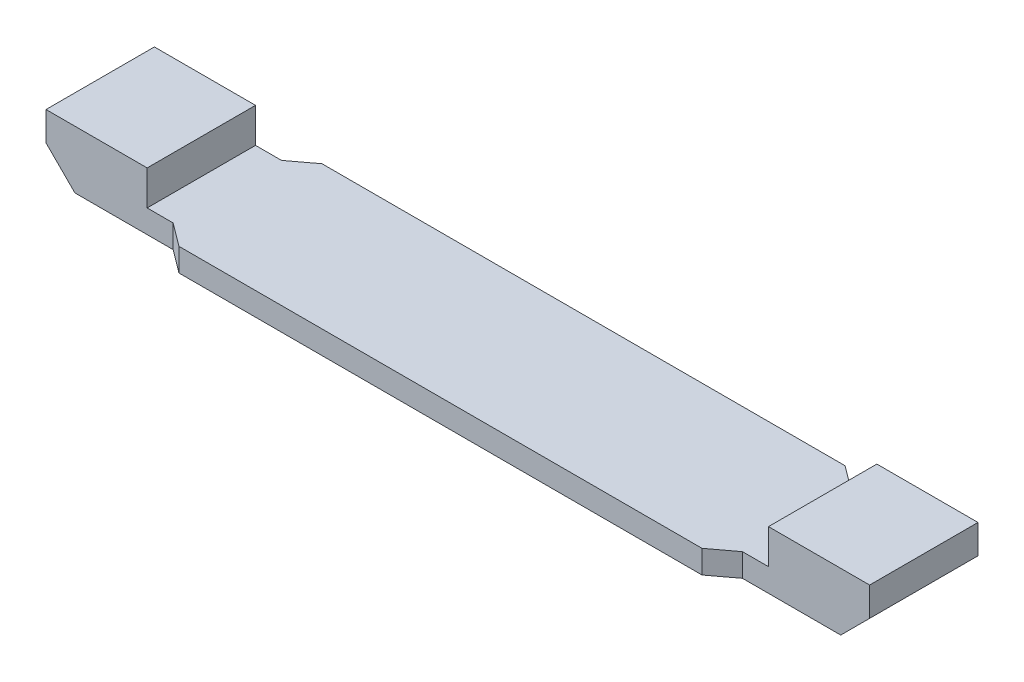
ISO-10303-21;
HEADER;
FILE_DESCRIPTION(('STEP AP214'),'2;1');
FILE_NAME('part.step','',(''),(''),'','','');
FILE_SCHEMA(('AUTOMOTIVE_DESIGN { 1 0 10303 214 1 1 1 1 }'));
ENDSEC;
DATA;
#1=APPLICATION_CONTEXT('core data for automotive mechanical design processes');
#2=APPLICATION_PROTOCOL_DEFINITION('international standard','automotive_design',2000,#1);
#3=PRODUCT_CONTEXT('',#1,'mechanical');
#4=PRODUCT('Part','Part','',(#3));
#5=PRODUCT_RELATED_PRODUCT_CATEGORY('part','',(#4));
#6=PRODUCT_DEFINITION_FORMATION('','',#4);
#7=PRODUCT_DEFINITION_CONTEXT('part definition',#1,'design');
#8=PRODUCT_DEFINITION('design','',#6,#7);
#9=PRODUCT_DEFINITION_SHAPE('','',#8);
#10=(LENGTH_UNIT() NAMED_UNIT(*) SI_UNIT(.MILLI.,.METRE.));
#11=(NAMED_UNIT(*) PLANE_ANGLE_UNIT() SI_UNIT($,.RADIAN.));
#12=(NAMED_UNIT(*) SI_UNIT($,.STERADIAN.) SOLID_ANGLE_UNIT());
#13=UNCERTAINTY_MEASURE_WITH_UNIT(LENGTH_MEASURE(1.E-05),#10,'distance_accuracy_value','');
#14=(GEOMETRIC_REPRESENTATION_CONTEXT(3) GLOBAL_UNCERTAINTY_ASSIGNED_CONTEXT((#13)) GLOBAL_UNIT_ASSIGNED_CONTEXT((#10,
#11,#12)) REPRESENTATION_CONTEXT('',''));
#15=CARTESIAN_POINT('',(0.,0.,0.));
#16=DIRECTION('',(0.,0.,1.));
#17=DIRECTION('',(1.,0.,0.));
#18=AXIS2_PLACEMENT_3D('',#15,#16,#17);
#19=CARTESIAN_POINT('',(0.,8.,0.));
#20=DIRECTION('',(0.,-1.,0.));
#21=DIRECTION('',(0.,0.,-1.));
#22=AXIS2_PLACEMENT_3D('',#19,#20,#21);
#23=PLANE('',#22);
#24=DIRECTION('',(0.8,0.,-0.6));
#25=VECTOR('',#24,1.);
#26=CARTESIAN_POINT('',(78.5999999999999,8.,104.8));
#27=LINE('',#26,#25);
#28=CARTESIAN_POINT('',(233.,8.,-11.));
#29=VERTEX_POINT('',#28);
#30=CARTESIAN_POINT('',(241.,8.,-17.));
#31=VERTEX_POINT('',#30);
#32=EDGE_CURVE('E199',#29,#31,#27,.T.);
#33=ORIENTED_EDGE('',*,*,#32,.T.);
#34=DIRECTION('',(1.,0.,0.));
#35=VECTOR('',#34,1.);
#36=CARTESIAN_POINT('',(0.,8.,-17.));
#37=LINE('',#36,#35);
#38=CARTESIAN_POINT('',(250.,8.,-17.));
#39=VERTEX_POINT('',#38);
#40=EDGE_CURVE('E322',#31,#39,#37,.T.);
#41=ORIENTED_EDGE('',*,*,#40,.T.);
#42=DIRECTION('',(0.,0.,1.));
#43=VECTOR('',#42,1.);
#44=CARTESIAN_POINT('',(250.,8.,-71.5));
#45=LINE('',#44,#43);
#46=CARTESIAN_POINT('',(250.,8.,-54.5));
#47=VERTEX_POINT('',#46);
#48=EDGE_CURVE('E196',#47,#39,#45,.T.);
#49=ORIENTED_EDGE('',*,*,#48,.F.);
#50=DIRECTION('',(-1.,0.,0.));
#51=VECTOR('',#50,1.);
#52=CARTESIAN_POINT('',(0.,8.,-54.5));
#53=LINE('',#52,#51);
#54=CARTESIAN_POINT('',(241.,8.,-54.5));
#55=VERTEX_POINT('',#54);
#56=EDGE_CURVE('E316',#47,#55,#53,.T.);
#57=ORIENTED_EDGE('',*,*,#56,.T.);
#58=DIRECTION('',(-0.800000000000001,0.,-0.599999999999999));
#59=VECTOR('',#58,1.);
#60=CARTESIAN_POINT('',(112.92,8.,-150.56));
#61=LINE('',#60,#59);
#62=CARTESIAN_POINT('',(233.,8.,-60.5));
#63=VERTEX_POINT('',#62);
#64=EDGE_CURVE('E325',#55,#63,#61,.T.);
#65=ORIENTED_EDGE('',*,*,#64,.T.);
#66=DIRECTION('',(-1.,0.,0.));
#67=VECTOR('',#66,1.);
#68=CARTESIAN_POINT('',(0.,8.,-60.5));
#69=LINE('',#68,#67);
#70=CARTESIAN_POINT('',(52.,8.,-60.5));
#71=VERTEX_POINT('',#70);
#72=EDGE_CURVE('E328',#63,#71,#69,.T.);
#73=ORIENTED_EDGE('',*,*,#72,.T.);
#74=DIRECTION('',(-0.8,0.,0.6));
#75=VECTOR('',#74,1.);
#76=CARTESIAN_POINT('',(-10.32,8.,-13.76));
#77=LINE('',#76,#75);
#78=CARTESIAN_POINT('',(44.,8.,-54.5));
#79=VERTEX_POINT('',#78);
#80=EDGE_CURVE('E331',#71,#79,#77,.T.);
#81=ORIENTED_EDGE('',*,*,#80,.T.);
#82=DIRECTION('',(-1.,0.,0.));
#83=VECTOR('',#82,1.);
#84=CARTESIAN_POINT('',(0.,8.,-54.5));
#85=LINE('',#84,#83);
#86=CARTESIAN_POINT('',(35.,8.,-54.5));
#87=VERTEX_POINT('',#86);
#88=EDGE_CURVE('E306',#79,#87,#85,.T.);
#89=ORIENTED_EDGE('',*,*,#88,.T.);
#90=DIRECTION('',(0.,0.,-1.));
#91=VECTOR('',#90,1.);
#92=CARTESIAN_POINT('',(35.,8.,-71.5));
#93=LINE('',#92,#91);
#94=CARTESIAN_POINT('',(35.,8.,-17.));
#95=VERTEX_POINT('',#94);
#96=EDGE_CURVE('E192',#95,#87,#93,.T.);
#97=ORIENTED_EDGE('',*,*,#96,.F.);
#98=DIRECTION('',(1.,0.,0.));
#99=VECTOR('',#98,1.);
#100=CARTESIAN_POINT('',(0.,8.,-17.));
#101=LINE('',#100,#99);
#102=CARTESIAN_POINT('',(44.,8.,-17.));
#103=VERTEX_POINT('',#102);
#104=EDGE_CURVE('E310',#95,#103,#101,.T.);
#105=ORIENTED_EDGE('',*,*,#104,.T.);
#106=DIRECTION('',(0.8,0.,0.6));
#107=VECTOR('',#106,1.);
#108=CARTESIAN_POINT('',(24.,8.,-32.));
#109=LINE('',#108,#107);
#110=CARTESIAN_POINT('',(52.,8.,-11.));
#111=VERTEX_POINT('',#110);
#112=EDGE_CURVE('E334',#103,#111,#109,.T.);
#113=ORIENTED_EDGE('',*,*,#112,.T.);
#114=DIRECTION('',(1.,0.,0.));
#115=VECTOR('',#114,1.);
#116=CARTESIAN_POINT('',(0.,8.,-11.));
#117=LINE('',#116,#115);
#118=EDGE_CURVE('E336',#111,#29,#117,.T.);
#119=ORIENTED_EDGE('',*,*,#118,.T.);
#120=EDGE_LOOP('',(#33,#41,#49,#57,#65,#73,#81,#89,#97,#105,#113,#119));
#121=FACE_BOUND('',#120,.T.);
#122=ADVANCED_FACE('F43',(#121),#23,.F.);
#123=CARTESIAN_POINT('',(0.,8.,0.));
#124=DIRECTION('',(1.,0.,0.));
#125=DIRECTION('',(0.,0.,-1.));
#126=AXIS2_PLACEMENT_3D('',#123,#124,#125);
#127=PLANE('',#126);
#128=DIRECTION('',(0.,-1.,0.));
#129=VECTOR('',#128,1.);
#130=CARTESIAN_POINT('',(0.,20.,-54.5));
#131=LINE('',#130,#129);
#132=CARTESIAN_POINT('',(0.,20.,-54.5));
#133=VERTEX_POINT('',#132);
#134=CARTESIAN_POINT('',(0.,10.,-54.5));
#135=VERTEX_POINT('',#134);
#136=EDGE_CURVE('E303',#133,#135,#131,.T.);
#137=ORIENTED_EDGE('',*,*,#136,.T.);
#138=DIRECTION('',(0.,0.,1.));
#139=VECTOR('',#138,1.);
#140=CARTESIAN_POINT('',(0.,10.,-17.));
#141=LINE('',#140,#139);
#142=CARTESIAN_POINT('',(0.,10.,-17.));
#143=VERTEX_POINT('',#142);
#144=EDGE_CURVE('E185',#135,#143,#141,.T.);
#145=ORIENTED_EDGE('',*,*,#144,.T.);
#146=DIRECTION('',(0.,-1.,0.));
#147=VECTOR('',#146,1.);
#148=CARTESIAN_POINT('',(0.,20.,-17.));
#149=LINE('',#148,#147);
#150=CARTESIAN_POINT('',(0.,20.,-17.));
#151=VERTEX_POINT('',#150);
#152=EDGE_CURVE('E171',#151,#143,#149,.T.);
#153=ORIENTED_EDGE('',*,*,#152,.F.);
#154=DIRECTION('',(0.,0.,1.));
#155=VECTOR('',#154,1.);
#156=CARTESIAN_POINT('',(0.,20.,-71.5));
#157=LINE('',#156,#155);
#158=EDGE_CURVE('E184',#133,#151,#157,.T.);
#159=ORIENTED_EDGE('',*,*,#158,.F.);
#160=EDGE_LOOP('',(#137,#145,#153,#159));
#161=FACE_BOUND('',#160,.T.);
#162=ADVANCED_FACE('F183',(#161),#127,.F.);
#163=CARTESIAN_POINT('',(285.,8.,0.));
#164=DIRECTION('',(-1.,0.,0.));
#165=DIRECTION('',(0.,0.,1.));
#166=AXIS2_PLACEMENT_3D('',#163,#164,#165);
#167=PLANE('',#166);
#168=DIRECTION('',(0.,-1.,0.));
#169=VECTOR('',#168,1.);
#170=CARTESIAN_POINT('',(285.,20.,-17.));
#171=LINE('',#170,#169);
#172=CARTESIAN_POINT('',(285.,20.,-17.));
#173=VERTEX_POINT('',#172);
#174=CARTESIAN_POINT('',(285.,10.,-17.));
#175=VERTEX_POINT('',#174);
#176=EDGE_CURVE('E270',#173,#175,#171,.T.);
#177=ORIENTED_EDGE('',*,*,#176,.T.);
#178=DIRECTION('',(0.,0.,-1.));
#179=VECTOR('',#178,1.);
#180=CARTESIAN_POINT('',(285.,10.,-54.5));
#181=LINE('',#180,#179);
#182=CARTESIAN_POINT('',(285.,10.,-54.5));
#183=VERTEX_POINT('',#182);
#184=EDGE_CURVE('E211',#175,#183,#181,.T.);
#185=ORIENTED_EDGE('',*,*,#184,.T.);
#186=DIRECTION('',(0.,-1.,0.));
#187=VECTOR('',#186,1.);
#188=CARTESIAN_POINT('',(285.,20.,-54.5));
#189=LINE('',#188,#187);
#190=CARTESIAN_POINT('',(285.,20.,-54.5));
#191=VERTEX_POINT('',#190);
#192=EDGE_CURVE('E286',#191,#183,#189,.T.);
#193=ORIENTED_EDGE('',*,*,#192,.F.);
#194=DIRECTION('',(0.,0.,-1.));
#195=VECTOR('',#194,1.);
#196=CARTESIAN_POINT('',(285.,20.,-71.5));
#197=LINE('',#196,#195);
#198=EDGE_CURVE('E204',#173,#191,#197,.T.);
#199=ORIENTED_EDGE('',*,*,#198,.F.);
#200=EDGE_LOOP('',(#177,#185,#193,#199));
#201=FACE_BOUND('',#200,.T.);
#202=ADVANCED_FACE('F249',(#201),#167,.F.);
#203=CARTESIAN_POINT('',(0.,0.,0.));
#204=DIRECTION('',(0.,-1.,0.));
#205=DIRECTION('',(0.,0.,-1.));
#206=AXIS2_PLACEMENT_3D('',#203,#204,#205);
#207=PLANE('',#206);
#208=DIRECTION('',(-1.,0.,0.));
#209=VECTOR('',#208,1.);
#210=CARTESIAN_POINT('',(285.,0.,-54.5));
#211=LINE('',#210,#209);
#212=CARTESIAN_POINT('',(275.,0.,-54.5));
#213=VERTEX_POINT('',#212);
#214=CARTESIAN_POINT('',(241.,0.,-54.5));
#215=VERTEX_POINT('',#214);
#216=EDGE_CURVE('E284',#213,#215,#211,.T.);
#217=ORIENTED_EDGE('',*,*,#216,.F.);
#218=DIRECTION('',(0.,0.,1.));
#219=VECTOR('',#218,1.);
#220=CARTESIAN_POINT('',(275.,0.,-17.));
#221=LINE('',#220,#219);
#222=CARTESIAN_POINT('',(275.,0.,-17.));
#223=VERTEX_POINT('',#222);
#224=EDGE_CURVE('E218',#213,#223,#221,.T.);
#225=ORIENTED_EDGE('',*,*,#224,.T.);
#226=DIRECTION('',(1.,0.,0.));
#227=VECTOR('',#226,1.);
#228=CARTESIAN_POINT('',(285.,0.,-17.));
#229=LINE('',#228,#227);
#230=CARTESIAN_POINT('',(241.,0.,-17.));
#231=VERTEX_POINT('',#230);
#232=EDGE_CURVE('E179',#231,#223,#229,.T.);
#233=ORIENTED_EDGE('',*,*,#232,.F.);
#234=DIRECTION('',(0.8,0.,-0.6));
#235=VECTOR('',#234,1.);
#236=CARTESIAN_POINT('',(241.,0.,-17.));
#237=LINE('',#236,#235);
#238=CARTESIAN_POINT('',(233.,0.,-11.));
#239=VERTEX_POINT('',#238);
#240=EDGE_CURVE('E387',#239,#231,#237,.T.);
#241=ORIENTED_EDGE('',*,*,#240,.F.);
#242=DIRECTION('',(1.,0.,0.));
#243=VECTOR('',#242,1.);
#244=CARTESIAN_POINT('',(52.,0.,-11.));
#245=LINE('',#244,#243);
#246=CARTESIAN_POINT('',(52.,0.,-11.));
#247=VERTEX_POINT('',#246);
#248=EDGE_CURVE('E349',#247,#239,#245,.T.);
#249=ORIENTED_EDGE('',*,*,#248,.F.);
#250=DIRECTION('',(0.8,0.,0.6));
#251=VECTOR('',#250,1.);
#252=CARTESIAN_POINT('',(44.,0.,-17.));
#253=LINE('',#252,#251);
#254=CARTESIAN_POINT('',(44.,0.,-17.));
#255=VERTEX_POINT('',#254);
#256=EDGE_CURVE('E233',#255,#247,#253,.T.);
#257=ORIENTED_EDGE('',*,*,#256,.F.);
#258=DIRECTION('',(1.,0.,0.));
#259=VECTOR('',#258,1.);
#260=CARTESIAN_POINT('',(0.,0.,-17.));
#261=LINE('',#260,#259);
#262=CARTESIAN_POINT('',(10.0000000000001,0.,-17.));
#263=VERTEX_POINT('',#262);
#264=EDGE_CURVE('E224',#263,#255,#261,.T.);
#265=ORIENTED_EDGE('',*,*,#264,.F.);
#266=DIRECTION('',(0.,0.,-1.));
#267=VECTOR('',#266,1.);
#268=CARTESIAN_POINT('',(10.0000000000001,0.,-54.5));
#269=LINE('',#268,#267);
#270=CARTESIAN_POINT('',(10.0000000000001,0.,-54.5));
#271=VERTEX_POINT('',#270);
#272=EDGE_CURVE('E216',#263,#271,#269,.T.);
#273=ORIENTED_EDGE('',*,*,#272,.T.);
#274=DIRECTION('',(-1.,0.,0.));
#275=VECTOR('',#274,1.);
#276=CARTESIAN_POINT('',(0.,0.,-54.5));
#277=LINE('',#276,#275);
#278=CARTESIAN_POINT('',(44.,0.,-54.5));
#279=VERTEX_POINT('',#278);
#280=EDGE_CURVE('E234',#279,#271,#277,.T.);
#281=ORIENTED_EDGE('',*,*,#280,.F.);
#282=DIRECTION('',(-0.8,0.,0.6));
#283=VECTOR('',#282,1.);
#284=CARTESIAN_POINT('',(44.,0.,-54.5));
#285=LINE('',#284,#283);
#286=CARTESIAN_POINT('',(52.,0.,-60.5));
#287=VERTEX_POINT('',#286);
#288=EDGE_CURVE('E302',#287,#279,#285,.T.);
#289=ORIENTED_EDGE('',*,*,#288,.F.);
#290=DIRECTION('',(-1.,0.,0.));
#291=VECTOR('',#290,1.);
#292=CARTESIAN_POINT('',(52.,0.,-60.5));
#293=LINE('',#292,#291);
#294=CARTESIAN_POINT('',(233.,0.,-60.5));
#295=VERTEX_POINT('',#294);
#296=EDGE_CURVE('E295',#295,#287,#293,.T.);
#297=ORIENTED_EDGE('',*,*,#296,.F.);
#298=DIRECTION('',(-0.800000000000001,0.,-0.599999999999999));
#299=VECTOR('',#298,1.);
#300=CARTESIAN_POINT('',(241.,0.,-54.5));
#301=LINE('',#300,#299);
#302=EDGE_CURVE('E292',#215,#295,#301,.T.);
#303=ORIENTED_EDGE('',*,*,#302,.F.);
#304=EDGE_LOOP('',(#217,#225,#233,#241,#249,#257,#265,#273,#281,#289,#297,#303));
#305=FACE_BOUND('',#304,.T.);
#306=ADVANCED_FACE('F229',(#305),#207,.T.);
#307=CARTESIAN_POINT('',(250.,20.,-71.5));
#308=DIRECTION('',(1.,0.,0.));
#309=DIRECTION('',(0.,0.,-1.));
#310=AXIS2_PLACEMENT_3D('',#307,#308,#309);
#311=PLANE('',#310);
#312=ORIENTED_EDGE('',*,*,#48,.T.);
#313=DIRECTION('',(0.,1.,0.));
#314=VECTOR('',#313,1.);
#315=CARTESIAN_POINT('',(250.,20.,-17.));
#316=LINE('',#315,#314);
#317=CARTESIAN_POINT('',(250.,20.,-17.));
#318=VERTEX_POINT('',#317);
#319=EDGE_CURVE('E319',#39,#318,#316,.T.);
#320=ORIENTED_EDGE('',*,*,#319,.T.);
#321=DIRECTION('',(0.,0.,1.));
#322=VECTOR('',#321,1.);
#323=CARTESIAN_POINT('',(250.,20.,-71.5));
#324=LINE('',#323,#322);
#325=CARTESIAN_POINT('',(250.,20.,-54.5));
#326=VERTEX_POINT('',#325);
#327=EDGE_CURVE('E205',#326,#318,#324,.T.);
#328=ORIENTED_EDGE('',*,*,#327,.F.);
#329=DIRECTION('',(0.,-1.,0.));
#330=VECTOR('',#329,1.);
#331=CARTESIAN_POINT('',(250.,20.,-54.5));
#332=LINE('',#331,#330);
#333=EDGE_CURVE('E313',#326,#47,#332,.T.);
#334=ORIENTED_EDGE('',*,*,#333,.T.);
#335=EDGE_LOOP('',(#312,#320,#328,#334));
#336=FACE_BOUND('',#335,.T.);
#337=ADVANCED_FACE('F258',(#336),#311,.F.);
#338=CARTESIAN_POINT('',(0.,20.,0.));
#339=DIRECTION('',(0.,-1.,0.));
#340=DIRECTION('',(0.,0.,-1.));
#341=AXIS2_PLACEMENT_3D('',#338,#339,#340);
#342=PLANE('',#341);
#343=ORIENTED_EDGE('',*,*,#327,.T.);
#344=DIRECTION('',(1.,0.,0.));
#345=VECTOR('',#344,1.);
#346=CARTESIAN_POINT('',(285.,20.,-17.));
#347=LINE('',#346,#345);
#348=EDGE_CURVE('E178',#318,#173,#347,.T.);
#349=ORIENTED_EDGE('',*,*,#348,.T.);
#350=ORIENTED_EDGE('',*,*,#198,.T.);
#351=DIRECTION('',(-1.,0.,0.));
#352=VECTOR('',#351,1.);
#353=CARTESIAN_POINT('',(285.,20.,-54.5));
#354=LINE('',#353,#352);
#355=EDGE_CURVE('E299',#191,#326,#354,.T.);
#356=ORIENTED_EDGE('',*,*,#355,.T.);
#357=EDGE_LOOP('',(#343,#349,#350,#356));
#358=FACE_BOUND('',#357,.T.);
#359=ADVANCED_FACE('F254',(#358),#342,.F.);
#360=CARTESIAN_POINT('',(35.,20.,-71.5));
#361=DIRECTION('',(-1.,0.,0.));
#362=DIRECTION('',(0.,0.,1.));
#363=AXIS2_PLACEMENT_3D('',#360,#361,#362);
#364=PLANE('',#363);
#365=DIRECTION('',(0.,0.,-1.));
#366=VECTOR('',#365,1.);
#367=CARTESIAN_POINT('',(35.,20.,-71.5));
#368=LINE('',#367,#366);
#369=CARTESIAN_POINT('',(35.,20.,-17.));
#370=VERTEX_POINT('',#369);
#371=CARTESIAN_POINT('',(35.,20.,-54.5));
#372=VERTEX_POINT('',#371);
#373=EDGE_CURVE('E191',#370,#372,#368,.T.);
#374=ORIENTED_EDGE('',*,*,#373,.F.);
#375=DIRECTION('',(0.,-1.,0.));
#376=VECTOR('',#375,1.);
#377=CARTESIAN_POINT('',(35.,20.,-17.));
#378=LINE('',#377,#376);
#379=EDGE_CURVE('E173',#370,#95,#378,.T.);
#380=ORIENTED_EDGE('',*,*,#379,.T.);
#381=ORIENTED_EDGE('',*,*,#96,.T.);
#382=DIRECTION('',(0.,1.,0.));
#383=VECTOR('',#382,1.);
#384=CARTESIAN_POINT('',(35.,20.,-54.5));
#385=LINE('',#384,#383);
#386=EDGE_CURVE('E276',#87,#372,#385,.T.);
#387=ORIENTED_EDGE('',*,*,#386,.T.);
#388=EDGE_LOOP('',(#374,#380,#381,#387));
#389=FACE_BOUND('',#388,.T.);
#390=ADVANCED_FACE('F418',(#389),#364,.F.);
#391=CARTESIAN_POINT('',(0.,20.,0.));
#392=DIRECTION('',(0.,1.,0.));
#393=DIRECTION('',(0.,0.,1.));
#394=AXIS2_PLACEMENT_3D('',#391,#392,#393);
#395=PLANE('',#394);
#396=DIRECTION('',(1.,0.,0.));
#397=VECTOR('',#396,1.);
#398=CARTESIAN_POINT('',(0.,20.,-17.));
#399=LINE('',#398,#397);
#400=EDGE_CURVE('E168',#151,#370,#399,.T.);
#401=ORIENTED_EDGE('',*,*,#400,.T.);
#402=ORIENTED_EDGE('',*,*,#373,.T.);
#403=DIRECTION('',(1.,0.,0.));
#404=VECTOR('',#403,1.);
#405=CARTESIAN_POINT('',(0.,20.,-54.5));
#406=LINE('',#405,#404);
#407=EDGE_CURVE('E190',#133,#372,#406,.T.);
#408=ORIENTED_EDGE('',*,*,#407,.F.);
#409=ORIENTED_EDGE('',*,*,#158,.T.);
#410=EDGE_LOOP('',(#401,#402,#408,#409));
#411=FACE_BOUND('',#410,.T.);
#412=ADVANCED_FACE('F189',(#411),#395,.T.);
#413=CARTESIAN_POINT('',(44.,20.,-54.5));
#414=DIRECTION('',(0.6,0.,0.8));
#415=DIRECTION('',(0.8,0.,-0.6));
#416=AXIS2_PLACEMENT_3D('',#413,#414,#415);
#417=PLANE('',#416);
#418=DIRECTION('',(0.,-1.,0.));
#419=VECTOR('',#418,1.);
#420=CARTESIAN_POINT('',(52.,20.,-60.5));
#421=LINE('',#420,#419);
#422=EDGE_CURVE('E363',#71,#287,#421,.T.);
#423=ORIENTED_EDGE('',*,*,#422,.T.);
#424=ORIENTED_EDGE('',*,*,#288,.T.);
#425=DIRECTION('',(0.,-1.,0.));
#426=VECTOR('',#425,1.);
#427=CARTESIAN_POINT('',(44.,20.,-54.5));
#428=LINE('',#427,#426);
#429=EDGE_CURVE('E365',#79,#279,#428,.T.);
#430=ORIENTED_EDGE('',*,*,#429,.F.);
#431=ORIENTED_EDGE('',*,*,#80,.F.);
#432=EDGE_LOOP('',(#423,#424,#430,#431));
#433=FACE_BOUND('',#432,.T.);
#434=ADVANCED_FACE('F376',(#433),#417,.F.);
#435=CARTESIAN_POINT('',(52.,20.,-60.5));
#436=DIRECTION('',(0.,0.,1.));
#437=DIRECTION('',(1.,0.,0.));
#438=AXIS2_PLACEMENT_3D('',#435,#436,#437);
#439=PLANE('',#438);
#440=DIRECTION('',(0.,-1.,0.));
#441=VECTOR('',#440,1.);
#442=CARTESIAN_POINT('',(233.,20.,-60.5));
#443=LINE('',#442,#441);
#444=EDGE_CURVE('E361',#63,#295,#443,.T.);
#445=ORIENTED_EDGE('',*,*,#444,.T.);
#446=ORIENTED_EDGE('',*,*,#296,.T.);
#447=ORIENTED_EDGE('',*,*,#422,.F.);
#448=ORIENTED_EDGE('',*,*,#72,.F.);
#449=EDGE_LOOP('',(#445,#446,#447,#448));
#450=FACE_BOUND('',#449,.T.);
#451=ADVANCED_FACE('F372',(#450),#439,.F.);
#452=CARTESIAN_POINT('',(241.,20.,-54.5));
#453=DIRECTION('',(-0.599999999999999,0.,0.800000000000001));
#454=DIRECTION('',(0.800000000000001,0.,0.599999999999999));
#455=AXIS2_PLACEMENT_3D('',#452,#453,#454);
#456=PLANE('',#455);
#457=DIRECTION('',(0.,-1.,0.));
#458=VECTOR('',#457,1.);
#459=CARTESIAN_POINT('',(241.,20.,-54.5));
#460=LINE('',#459,#458);
#461=EDGE_CURVE('E359',#55,#215,#460,.T.);
#462=ORIENTED_EDGE('',*,*,#461,.T.);
#463=ORIENTED_EDGE('',*,*,#302,.T.);
#464=ORIENTED_EDGE('',*,*,#444,.F.);
#465=ORIENTED_EDGE('',*,*,#64,.F.);
#466=EDGE_LOOP('',(#462,#463,#464,#465));
#467=FACE_BOUND('',#466,.T.);
#468=ADVANCED_FACE('F379',(#467),#456,.F.);
#469=CARTESIAN_POINT('',(285.,20.,-54.5));
#470=DIRECTION('',(0.,0.,1.));
#471=DIRECTION('',(1.,0.,0.));
#472=AXIS2_PLACEMENT_3D('',#469,#470,#471);
#473=PLANE('',#472);
#474=ORIENTED_EDGE('',*,*,#192,.T.);
#475=DIRECTION('',(-0.707106781186549,-0.707106781186546,0.));
#476=VECTOR('',#475,1.);
#477=CARTESIAN_POINT('',(285.,10.,-54.5));
#478=LINE('',#477,#476);
#479=EDGE_CURVE('E214',#183,#213,#478,.T.);
#480=ORIENTED_EDGE('',*,*,#479,.T.);
#481=ORIENTED_EDGE('',*,*,#216,.T.);
#482=ORIENTED_EDGE('',*,*,#461,.F.);
#483=ORIENTED_EDGE('',*,*,#56,.F.);
#484=ORIENTED_EDGE('',*,*,#333,.F.);
#485=ORIENTED_EDGE('',*,*,#355,.F.);
#486=EDGE_LOOP('',(#474,#480,#481,#482,#483,#484,#485));
#487=FACE_BOUND('',#486,.T.);
#488=ADVANCED_FACE('F282',(#487),#473,.F.);
#489=CARTESIAN_POINT('',(0.,20.,-54.5));
#490=DIRECTION('',(0.,0.,1.));
#491=DIRECTION('',(1.,0.,0.));
#492=AXIS2_PLACEMENT_3D('',#489,#490,#491);
#493=PLANE('',#492);
#494=ORIENTED_EDGE('',*,*,#280,.T.);
#495=DIRECTION('',(-0.707106781186549,0.707106781186546,0.));
#496=VECTOR('',#495,1.);
#497=CARTESIAN_POINT('',(0.,10.,-54.5));
#498=LINE('',#497,#496);
#499=EDGE_CURVE('E11',#271,#135,#498,.T.);
#500=ORIENTED_EDGE('',*,*,#499,.T.);
#501=ORIENTED_EDGE('',*,*,#136,.F.);
#502=ORIENTED_EDGE('',*,*,#407,.T.);
#503=ORIENTED_EDGE('',*,*,#386,.F.);
#504=ORIENTED_EDGE('',*,*,#88,.F.);
#505=ORIENTED_EDGE('',*,*,#429,.T.);
#506=EDGE_LOOP('',(#494,#500,#501,#502,#503,#504,#505));
#507=FACE_BOUND('',#506,.T.);
#508=ADVANCED_FACE('F404',(#507),#493,.F.);
#509=CARTESIAN_POINT('',(241.,20.,-17.));
#510=DIRECTION('',(-0.6,0.,-0.8));
#511=DIRECTION('',(-0.8,0.,0.6));
#512=AXIS2_PLACEMENT_3D('',#509,#510,#511);
#513=PLANE('',#512);
#514=DIRECTION('',(0.,-1.,0.));
#515=VECTOR('',#514,1.);
#516=CARTESIAN_POINT('',(233.,20.,-11.));
#517=LINE('',#516,#515);
#518=EDGE_CURVE('E344',#29,#239,#517,.T.);
#519=ORIENTED_EDGE('',*,*,#518,.T.);
#520=ORIENTED_EDGE('',*,*,#240,.T.);
#521=DIRECTION('',(0.,-1.,0.));
#522=VECTOR('',#521,1.);
#523=CARTESIAN_POINT('',(241.,20.,-17.));
#524=LINE('',#523,#522);
#525=EDGE_CURVE('E277',#31,#231,#524,.T.);
#526=ORIENTED_EDGE('',*,*,#525,.F.);
#527=ORIENTED_EDGE('',*,*,#32,.F.);
#528=EDGE_LOOP('',(#519,#520,#526,#527));
#529=FACE_BOUND('',#528,.T.);
#530=ADVANCED_FACE('F342',(#529),#513,.F.);
#531=CARTESIAN_POINT('',(52.,20.,-11.));
#532=DIRECTION('',(0.,0.,-1.));
#533=DIRECTION('',(-1.,0.,0.));
#534=AXIS2_PLACEMENT_3D('',#531,#532,#533);
#535=PLANE('',#534);
#536=DIRECTION('',(0.,-1.,0.));
#537=VECTOR('',#536,1.);
#538=CARTESIAN_POINT('',(52.,20.,-11.));
#539=LINE('',#538,#537);
#540=EDGE_CURVE('E351',#111,#247,#539,.T.);
#541=ORIENTED_EDGE('',*,*,#540,.T.);
#542=ORIENTED_EDGE('',*,*,#248,.T.);
#543=ORIENTED_EDGE('',*,*,#518,.F.);
#544=ORIENTED_EDGE('',*,*,#118,.F.);
#545=EDGE_LOOP('',(#541,#542,#543,#544));
#546=FACE_BOUND('',#545,.T.);
#547=ADVANCED_FACE('F347',(#546),#535,.F.);
#548=CARTESIAN_POINT('',(44.,20.,-17.));
#549=DIRECTION('',(0.6,0.,-0.8));
#550=DIRECTION('',(-0.8,0.,-0.6));
#551=AXIS2_PLACEMENT_3D('',#548,#549,#550);
#552=PLANE('',#551);
#553=DIRECTION('',(0.,-1.,0.));
#554=VECTOR('',#553,1.);
#555=CARTESIAN_POINT('',(44.,20.,-17.));
#556=LINE('',#555,#554);
#557=EDGE_CURVE('E186',#103,#255,#556,.T.);
#558=ORIENTED_EDGE('',*,*,#557,.T.);
#559=ORIENTED_EDGE('',*,*,#256,.T.);
#560=ORIENTED_EDGE('',*,*,#540,.F.);
#561=ORIENTED_EDGE('',*,*,#112,.F.);
#562=EDGE_LOOP('',(#558,#559,#560,#561));
#563=FACE_BOUND('',#562,.T.);
#564=ADVANCED_FACE('F391',(#563),#552,.F.);
#565=CARTESIAN_POINT('',(285.,20.,-17.));
#566=DIRECTION('',(0.,0.,-1.));
#567=DIRECTION('',(-1.,0.,0.));
#568=AXIS2_PLACEMENT_3D('',#565,#566,#567);
#569=PLANE('',#568);
#570=ORIENTED_EDGE('',*,*,#232,.T.);
#571=DIRECTION('',(0.707106781186549,0.707106781186546,0.));
#572=VECTOR('',#571,1.);
#573=CARTESIAN_POINT('',(285.,10.,-17.));
#574=LINE('',#573,#572);
#575=EDGE_CURVE('E220',#223,#175,#574,.T.);
#576=ORIENTED_EDGE('',*,*,#575,.T.);
#577=ORIENTED_EDGE('',*,*,#176,.F.);
#578=ORIENTED_EDGE('',*,*,#348,.F.);
#579=ORIENTED_EDGE('',*,*,#319,.F.);
#580=ORIENTED_EDGE('',*,*,#40,.F.);
#581=ORIENTED_EDGE('',*,*,#525,.T.);
#582=EDGE_LOOP('',(#570,#576,#577,#578,#579,#580,#581));
#583=FACE_BOUND('',#582,.T.);
#584=ADVANCED_FACE('F389',(#583),#569,.F.);
#585=CARTESIAN_POINT('',(0.,20.,-17.));
#586=DIRECTION('',(0.,0.,-1.));
#587=DIRECTION('',(-1.,0.,0.));
#588=AXIS2_PLACEMENT_3D('',#585,#586,#587);
#589=PLANE('',#588);
#590=ORIENTED_EDGE('',*,*,#152,.T.);
#591=DIRECTION('',(0.707106781186549,-0.707106781186546,0.));
#592=VECTOR('',#591,1.);
#593=CARTESIAN_POINT('',(0.,10.,-17.));
#594=LINE('',#593,#592);
#595=EDGE_CURVE('E52',#143,#263,#594,.T.);
#596=ORIENTED_EDGE('',*,*,#595,.T.);
#597=ORIENTED_EDGE('',*,*,#264,.T.);
#598=ORIENTED_EDGE('',*,*,#557,.F.);
#599=ORIENTED_EDGE('',*,*,#104,.F.);
#600=ORIENTED_EDGE('',*,*,#379,.F.);
#601=ORIENTED_EDGE('',*,*,#400,.F.);
#602=EDGE_LOOP('',(#590,#596,#597,#598,#599,#600,#601));
#603=FACE_BOUND('',#602,.T.);
#604=ADVANCED_FACE('F170',(#603),#589,.F.);
#605=CARTESIAN_POINT('',(285.,10.,0.));
#606=DIRECTION('',(0.707106781186545,-0.707106781186549,0.));
#607=DIRECTION('',(0.,0.,1.));
#608=AXIS2_PLACEMENT_3D('',#605,#606,#607);
#609=PLANE('',#608);
#610=ORIENTED_EDGE('',*,*,#575,.F.);
#611=ORIENTED_EDGE('',*,*,#224,.F.);
#612=ORIENTED_EDGE('',*,*,#479,.F.);
#613=ORIENTED_EDGE('',*,*,#184,.F.);
#614=EDGE_LOOP('',(#610,#611,#612,#613));
#615=FACE_BOUND('',#614,.T.);
#616=ADVANCED_FACE('F237',(#615),#609,.T.);
#617=CARTESIAN_POINT('',(0.,10.,0.));
#618=DIRECTION('',(-0.707106781186545,-0.707106781186549,0.));
#619=DIRECTION('',(0.,0.,-1.));
#620=AXIS2_PLACEMENT_3D('',#617,#618,#619);
#621=PLANE('',#620);
#622=ORIENTED_EDGE('',*,*,#499,.F.);
#623=ORIENTED_EDGE('',*,*,#272,.F.);
#624=ORIENTED_EDGE('',*,*,#595,.F.);
#625=ORIENTED_EDGE('',*,*,#144,.F.);
#626=EDGE_LOOP('',(#622,#623,#624,#625));
#627=FACE_BOUND('',#626,.T.);
#628=ADVANCED_FACE('F46',(#627),#621,.T.);
#629=CLOSED_SHELL('',(#122,#162,#202,#306,#337,#359,#390,#412,#434,#451,#468,#488,#508,#530,
#547,#564,#584,#604,#616,#628));
#630=MANIFOLD_SOLID_BREP('B2',#629);
#631=ADVANCED_BREP_SHAPE_REPRESENTATION('',(#18,#630),#14);
#632=SHAPE_DEFINITION_REPRESENTATION(#9,#631);
ENDSEC;
END-ISO-10303-21;
